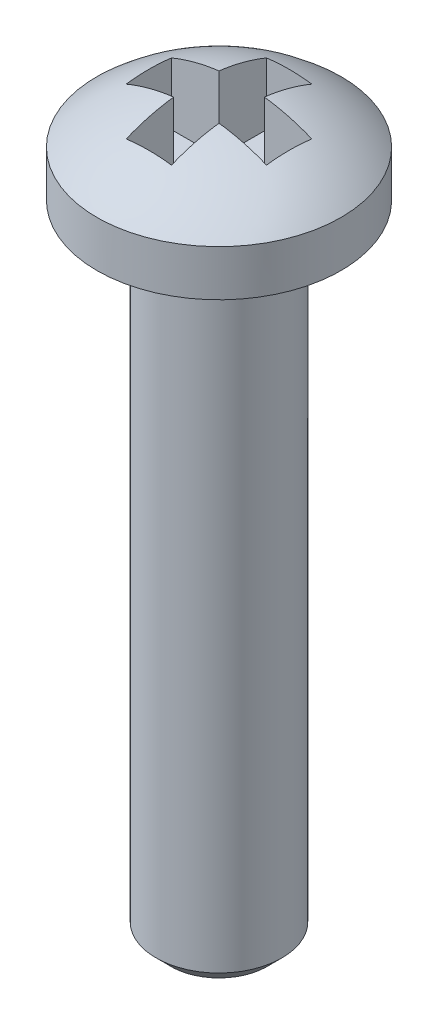
ISO-10303-21;
HEADER;
FILE_DESCRIPTION(('STEP AP214'),'2;1');
FILE_NAME('part.step','',(''),(''),'','','');
FILE_SCHEMA(('AUTOMOTIVE_DESIGN { 1 0 10303 214 1 1 1 1 }'));
ENDSEC;
DATA;
#1=APPLICATION_CONTEXT('core data for automotive mechanical design processes');
#2=APPLICATION_PROTOCOL_DEFINITION('international standard','automotive_design',2000,#1);
#3=PRODUCT_CONTEXT('',#1,'mechanical');
#4=PRODUCT('Part','Part','',(#3));
#5=PRODUCT_RELATED_PRODUCT_CATEGORY('part','',(#4));
#6=PRODUCT_DEFINITION_FORMATION('','',#4);
#7=PRODUCT_DEFINITION_CONTEXT('part definition',#1,'design');
#8=PRODUCT_DEFINITION('design','',#6,#7);
#9=PRODUCT_DEFINITION_SHAPE('','',#8);
#10=(LENGTH_UNIT() NAMED_UNIT(*) SI_UNIT(.MILLI.,.METRE.));
#11=(NAMED_UNIT(*) PLANE_ANGLE_UNIT() SI_UNIT($,.RADIAN.));
#12=(NAMED_UNIT(*) SI_UNIT($,.STERADIAN.) SOLID_ANGLE_UNIT());
#13=UNCERTAINTY_MEASURE_WITH_UNIT(LENGTH_MEASURE(1.E-05),#10,'distance_accuracy_value','');
#14=(GEOMETRIC_REPRESENTATION_CONTEXT(3) GLOBAL_UNCERTAINTY_ASSIGNED_CONTEXT((#13)) GLOBAL_UNIT_ASSIGNED_CONTEXT((#10,
#11,#12)) REPRESENTATION_CONTEXT('',''));
#15=CARTESIAN_POINT('',(0.,0.,0.));
#16=DIRECTION('',(0.,0.,1.));
#17=DIRECTION('',(1.,0.,0.));
#18=AXIS2_PLACEMENT_3D('',#15,#16,#17);
#19=CARTESIAN_POINT('',(0.,0.,0.));
#20=DIRECTION('',(0.,-1.,0.));
#21=DIRECTION('',(0.,0.,-1.));
#22=AXIS2_PLACEMENT_3D('',#19,#20,#21);
#23=PLANE('',#22);
#24=CARTESIAN_POINT('',(0.,0.,0.));
#25=DIRECTION('',(0.,-1.,0.));
#26=DIRECTION('',(0.,0.,-1.));
#27=AXIS2_PLACEMENT_3D('',#24,#25,#26);
#28=CIRCLE('',#27,0.8382);
#29=CARTESIAN_POINT('',(0.,0.,-0.8382));
#30=VERTEX_POINT('',#29);
#31=EDGE_CURVE('E200',#30,#30,#28,.T.);
#32=ORIENTED_EDGE('',*,*,#31,.T.);
#33=EDGE_LOOP('',(#32));
#34=FACE_BOUND('',#33,.T.);
#35=ADVANCED_FACE('F38',(#34),#23,.T.);
#36=CARTESIAN_POINT('',(0.,9.50161587301587,0.));
#37=DIRECTION('',(0.,-1.,0.));
#38=DIRECTION('',(1.,0.,0.));
#39=AXIS2_PLACEMENT_3D('',#36,#37,#38);
#40=SPHERICAL_SURFACE('',#39,3.21108412698413);
#41=CARTESIAN_POINT('',(-1.2192,9.50161587301587,0.));
#42=DIRECTION('',(-1.,0.,0.));
#43=DIRECTION('',(0.,0.,1.));
#44=AXIS2_PLACEMENT_3D('',#41,#42,#43);
#45=CIRCLE('',#44,2.97062495622881);
#46=CARTESIAN_POINT('',(-1.2192,12.4460365190122,-0.3937));
#47=VERTEX_POINT('',#46);
#48=CARTESIAN_POINT('',(-1.2192,12.4460365190122,0.3937));
#49=VERTEX_POINT('',#48);
#50=EDGE_CURVE('E12',#47,#49,#45,.F.);
#51=ORIENTED_EDGE('',*,*,#50,.F.);
#52=CARTESIAN_POINT('',(0.,9.50161587301587,-0.3937));
#53=DIRECTION('',(0.,0.,-1.));
#54=DIRECTION('',(-1.,0.,0.));
#55=AXIS2_PLACEMENT_3D('',#52,#53,#54);
#56=CIRCLE('',#55,3.18685763418597);
#57=CARTESIAN_POINT('',(-0.3937,12.6640614283685,-0.3937));
#58=VERTEX_POINT('',#57);
#59=EDGE_CURVE('E215',#58,#47,#56,.F.);
#60=ORIENTED_EDGE('',*,*,#59,.F.);
#61=CARTESIAN_POINT('',(-0.3937,9.50161587301587,0.));
#62=DIRECTION('',(-1.,0.,0.));
#63=DIRECTION('',(0.,0.,1.));
#64=AXIS2_PLACEMENT_3D('',#61,#62,#63);
#65=CIRCLE('',#64,3.18685763418597);
#66=CARTESIAN_POINT('',(-0.3937,12.4460365190122,-1.2192));
#67=VERTEX_POINT('',#66);
#68=EDGE_CURVE('E217',#67,#58,#65,.F.);
#69=ORIENTED_EDGE('',*,*,#68,.F.);
#70=CARTESIAN_POINT('',(0.,9.50161587301587,-1.2192));
#71=DIRECTION('',(0.,0.,-1.));
#72=DIRECTION('',(-1.,0.,0.));
#73=AXIS2_PLACEMENT_3D('',#70,#71,#72);
#74=CIRCLE('',#73,2.97062495622881);
#75=CARTESIAN_POINT('',(0.3937,12.4460365190122,-1.2192));
#76=VERTEX_POINT('',#75);
#77=EDGE_CURVE('E219',#76,#67,#74,.F.);
#78=ORIENTED_EDGE('',*,*,#77,.F.);
#79=CARTESIAN_POINT('',(0.3937,9.50161587301587,0.));
#80=DIRECTION('',(1.,0.,0.));
#81=DIRECTION('',(0.,0.,-1.));
#82=AXIS2_PLACEMENT_3D('',#79,#80,#81);
#83=CIRCLE('',#82,3.18685763418597);
#84=CARTESIAN_POINT('',(0.3937,12.6640614283685,-0.3937));
#85=VERTEX_POINT('',#84);
#86=EDGE_CURVE('E221',#85,#76,#83,.F.);
#87=ORIENTED_EDGE('',*,*,#86,.F.);
#88=CARTESIAN_POINT('',(0.,9.50161587301587,-0.3937));
#89=DIRECTION('',(0.,0.,-1.));
#90=DIRECTION('',(-1.,0.,0.));
#91=AXIS2_PLACEMENT_3D('',#88,#89,#90);
#92=CIRCLE('',#91,3.18685763418597);
#93=CARTESIAN_POINT('',(1.2192,12.4460365190122,-0.3937));
#94=VERTEX_POINT('',#93);
#95=EDGE_CURVE('E223',#94,#85,#92,.F.);
#96=ORIENTED_EDGE('',*,*,#95,.F.);
#97=CARTESIAN_POINT('',(1.2192,9.50161587301587,0.));
#98=DIRECTION('',(1.,0.,0.));
#99=DIRECTION('',(0.,0.,-1.));
#100=AXIS2_PLACEMENT_3D('',#97,#98,#99);
#101=CIRCLE('',#100,2.97062495622881);
#102=CARTESIAN_POINT('',(1.2192,12.4460365190122,0.3937));
#103=VERTEX_POINT('',#102);
#104=EDGE_CURVE('E225',#103,#94,#101,.F.);
#105=ORIENTED_EDGE('',*,*,#104,.F.);
#106=CARTESIAN_POINT('',(0.,9.50161587301587,0.3937));
#107=DIRECTION('',(0.,0.,1.));
#108=DIRECTION('',(1.,0.,0.));
#109=AXIS2_PLACEMENT_3D('',#106,#107,#108);
#110=CIRCLE('',#109,3.18685763418597);
#111=CARTESIAN_POINT('',(0.3937,12.6640614283685,0.3937));
#112=VERTEX_POINT('',#111);
#113=EDGE_CURVE('E227',#112,#103,#110,.F.);
#114=ORIENTED_EDGE('',*,*,#113,.F.);
#115=CARTESIAN_POINT('',(0.3937,9.50161587301587,0.));
#116=DIRECTION('',(1.,0.,0.));
#117=DIRECTION('',(0.,0.,-1.));
#118=AXIS2_PLACEMENT_3D('',#115,#116,#117);
#119=CIRCLE('',#118,3.18685763418597);
#120=CARTESIAN_POINT('',(0.3937,12.4460365190122,1.2192));
#121=VERTEX_POINT('',#120);
#122=EDGE_CURVE('E229',#121,#112,#119,.F.);
#123=ORIENTED_EDGE('',*,*,#122,.F.);
#124=CARTESIAN_POINT('',(0.,9.50161587301587,1.2192));
#125=DIRECTION('',(0.,0.,1.));
#126=DIRECTION('',(1.,0.,0.));
#127=AXIS2_PLACEMENT_3D('',#124,#125,#126);
#128=CIRCLE('',#127,2.97062495622881);
#129=CARTESIAN_POINT('',(-0.3937,12.4460365190122,1.2192));
#130=VERTEX_POINT('',#129);
#131=EDGE_CURVE('E231',#130,#121,#128,.F.);
#132=ORIENTED_EDGE('',*,*,#131,.F.);
#133=CARTESIAN_POINT('',(-0.3937,9.50161587301587,0.));
#134=DIRECTION('',(-1.,0.,0.));
#135=DIRECTION('',(0.,0.,1.));
#136=AXIS2_PLACEMENT_3D('',#133,#134,#135);
#137=CIRCLE('',#136,3.18685763418597);
#138=CARTESIAN_POINT('',(-0.3937,12.6640614283685,0.3937));
#139=VERTEX_POINT('',#138);
#140=EDGE_CURVE('E233',#139,#130,#137,.F.);
#141=ORIENTED_EDGE('',*,*,#140,.F.);
#142=CARTESIAN_POINT('',(0.,9.50161587301587,0.3937));
#143=DIRECTION('',(0.,0.,1.));
#144=DIRECTION('',(1.,0.,0.));
#145=AXIS2_PLACEMENT_3D('',#142,#143,#144);
#146=CIRCLE('',#145,3.18685763418597);
#147=EDGE_CURVE('E45',#49,#139,#146,.F.);
#148=ORIENTED_EDGE('',*,*,#147,.F.);
#149=EDGE_LOOP('',(#51,#60,#69,#78,#87,#96,#105,#114,#123,#132,#141,#148));
#150=FACE_BOUND('',#149,.T.);
#151=CARTESIAN_POINT('',(0.,11.9126,0.));
#152=DIRECTION('',(0.,-1.,0.));
#153=DIRECTION('',(0.,0.,-1.));
#154=AXIS2_PLACEMENT_3D('',#151,#152,#153);
#155=CIRCLE('',#154,2.1209);
#156=CARTESIAN_POINT('',(0.,11.9126,-2.1209));
#157=VERTEX_POINT('',#156);
#158=EDGE_CURVE('E212',#157,#157,#155,.T.);
#159=ORIENTED_EDGE('',*,*,#158,.F.);
#160=EDGE_LOOP('',(#159));
#161=FACE_BOUND('',#160,.T.);
#162=ADVANCED_FACE('F240',(#150,#161),#40,.T.);
#163=CARTESIAN_POINT('',(0.,0.,0.));
#164=DIRECTION('',(0.,-1.,0.));
#165=DIRECTION('',(0.,0.,-1.));
#166=AXIS2_PLACEMENT_3D('',#163,#164,#165);
#167=CYLINDRICAL_SURFACE('',#166,2.1209);
#168=ORIENTED_EDGE('',*,*,#158,.T.);
#169=EDGE_LOOP('',(#168));
#170=FACE_BOUND('',#169,.T.);
#171=CARTESIAN_POINT('',(0.,11.1125,0.));
#172=DIRECTION('',(0.,-1.,0.));
#173=DIRECTION('',(0.,0.,-1.));
#174=AXIS2_PLACEMENT_3D('',#171,#172,#173);
#175=CIRCLE('',#174,2.1209);
#176=CARTESIAN_POINT('',(0.,11.1125,-2.1209));
#177=VERTEX_POINT('',#176);
#178=EDGE_CURVE('E209',#177,#177,#175,.T.);
#179=ORIENTED_EDGE('',*,*,#178,.F.);
#180=EDGE_LOOP('',(#179));
#181=FACE_BOUND('',#180,.T.);
#182=ADVANCED_FACE('F285',(#170,#181),#167,.T.);
#183=CARTESIAN_POINT('',(1.0922,11.1125,0.));
#184=DIRECTION('',(0.,-1.,0.));
#185=DIRECTION('',(0.,0.,-1.));
#186=AXIS2_PLACEMENT_3D('',#183,#184,#185);
#187=PLANE('',#186);
#188=ORIENTED_EDGE('',*,*,#178,.T.);
#189=EDGE_LOOP('',(#188));
#190=FACE_BOUND('',#189,.T.);
#191=CARTESIAN_POINT('',(0.,11.1125,0.));
#192=DIRECTION('',(0.,-1.,0.));
#193=DIRECTION('',(0.,0.,-1.));
#194=AXIS2_PLACEMENT_3D('',#191,#192,#193);
#195=CIRCLE('',#194,1.0922);
#196=CARTESIAN_POINT('',(0.,11.1125,-1.0922));
#197=VERTEX_POINT('',#196);
#198=EDGE_CURVE('E206',#197,#197,#195,.T.);
#199=ORIENTED_EDGE('',*,*,#198,.F.);
#200=EDGE_LOOP('',(#199));
#201=FACE_BOUND('',#200,.T.);
#202=ADVANCED_FACE('F298',(#190,#201),#187,.T.);
#203=CARTESIAN_POINT('',(0.,0.,0.));
#204=DIRECTION('',(0.,-1.,0.));
#205=DIRECTION('',(0.,0.,-1.));
#206=AXIS2_PLACEMENT_3D('',#203,#204,#205);
#207=CYLINDRICAL_SURFACE('',#206,1.0922);
#208=ORIENTED_EDGE('',*,*,#198,.T.);
#209=EDGE_LOOP('',(#208));
#210=FACE_BOUND('',#209,.T.);
#211=CARTESIAN_POINT('',(0.,0.254,0.));
#212=DIRECTION('',(0.,-1.,0.));
#213=DIRECTION('',(0.,0.,-1.));
#214=AXIS2_PLACEMENT_3D('',#211,#212,#213);
#215=CIRCLE('',#214,1.0922);
#216=CARTESIAN_POINT('',(0.,0.254,-1.0922));
#217=VERTEX_POINT('',#216);
#218=EDGE_CURVE('E203',#217,#217,#215,.T.);
#219=ORIENTED_EDGE('',*,*,#218,.F.);
#220=EDGE_LOOP('',(#219));
#221=FACE_BOUND('',#220,.T.);
#222=ADVANCED_FACE('F290',(#210,#221),#207,.T.);
#223=CARTESIAN_POINT('',(0.,0.,0.));
#224=DIRECTION('',(0.,1.,0.));
#225=DIRECTION('',(0.,0.,1.));
#226=AXIS2_PLACEMENT_3D('',#223,#224,#225);
#227=CONICAL_SURFACE('',#226,0.8382,0.785398163397448);
#228=ORIENTED_EDGE('',*,*,#218,.T.);
#229=EDGE_LOOP('',(#228));
#230=FACE_BOUND('',#229,.T.);
#231=ORIENTED_EDGE('',*,*,#31,.F.);
#232=EDGE_LOOP('',(#231));
#233=FACE_BOUND('',#232,.T.);
#234=ADVANCED_FACE('F288',(#230,#233),#227,.T.);
#235=CARTESIAN_POINT('',(1.0922,11.3665,0.));
#236=DIRECTION('',(0.,-1.,0.));
#237=DIRECTION('',(0.,0.,-1.));
#238=AXIS2_PLACEMENT_3D('',#235,#236,#237);
#239=PLANE('',#238);
#240=DIRECTION('',(-1.,0.,0.));
#241=VECTOR('',#240,1.);
#242=CARTESIAN_POINT('',(-1.2192,11.3665,-0.3937));
#243=LINE('',#242,#241);
#244=CARTESIAN_POINT('',(-0.3937,11.3665,-0.3937));
#245=VERTEX_POINT('',#244);
#246=CARTESIAN_POINT('',(-1.2192,11.3665,-0.3937));
#247=VERTEX_POINT('',#246);
#248=EDGE_CURVE('E142',#245,#247,#243,.T.);
#249=ORIENTED_EDGE('',*,*,#248,.T.);
#250=DIRECTION('',(0.,0.,1.));
#251=VECTOR('',#250,1.);
#252=CARTESIAN_POINT('',(-1.2192,11.3665,0.3937));
#253=LINE('',#252,#251);
#254=CARTESIAN_POINT('',(-1.2192,11.3665,0.3937));
#255=VERTEX_POINT('',#254);
#256=EDGE_CURVE('E137',#247,#255,#253,.T.);
#257=ORIENTED_EDGE('',*,*,#256,.T.);
#258=DIRECTION('',(1.,0.,0.));
#259=VECTOR('',#258,1.);
#260=CARTESIAN_POINT('',(-0.3937,11.3665,0.3937));
#261=LINE('',#260,#259);
#262=CARTESIAN_POINT('',(-0.3937,11.3665,0.3937));
#263=VERTEX_POINT('',#262);
#264=EDGE_CURVE('E126',#255,#263,#261,.T.);
#265=ORIENTED_EDGE('',*,*,#264,.T.);
#266=DIRECTION('',(0.,0.,1.));
#267=VECTOR('',#266,1.);
#268=CARTESIAN_POINT('',(-0.3937,11.3665,1.2192));
#269=LINE('',#268,#267);
#270=CARTESIAN_POINT('',(-0.3937,11.3665,1.2192));
#271=VERTEX_POINT('',#270);
#272=EDGE_CURVE('E179',#263,#271,#269,.T.);
#273=ORIENTED_EDGE('',*,*,#272,.T.);
#274=DIRECTION('',(1.,0.,0.));
#275=VECTOR('',#274,1.);
#276=CARTESIAN_POINT('',(0.3937,11.3665,1.2192));
#277=LINE('',#276,#275);
#278=CARTESIAN_POINT('',(0.3937,11.3665,1.2192));
#279=VERTEX_POINT('',#278);
#280=EDGE_CURVE('E175',#271,#279,#277,.T.);
#281=ORIENTED_EDGE('',*,*,#280,.T.);
#282=DIRECTION('',(0.,0.,-1.));
#283=VECTOR('',#282,1.);
#284=CARTESIAN_POINT('',(0.3937,11.3665,0.3937));
#285=LINE('',#284,#283);
#286=CARTESIAN_POINT('',(0.3937,11.3665,0.3937));
#287=VERTEX_POINT('',#286);
#288=EDGE_CURVE('E171',#279,#287,#285,.T.);
#289=ORIENTED_EDGE('',*,*,#288,.T.);
#290=DIRECTION('',(1.,0.,0.));
#291=VECTOR('',#290,1.);
#292=CARTESIAN_POINT('',(1.2192,11.3665,0.3937));
#293=LINE('',#292,#291);
#294=CARTESIAN_POINT('',(1.2192,11.3665,0.3937));
#295=VERTEX_POINT('',#294);
#296=EDGE_CURVE('E167',#287,#295,#293,.T.);
#297=ORIENTED_EDGE('',*,*,#296,.T.);
#298=DIRECTION('',(0.,0.,-1.));
#299=VECTOR('',#298,1.);
#300=CARTESIAN_POINT('',(1.2192,11.3665,-0.3937));
#301=LINE('',#300,#299);
#302=CARTESIAN_POINT('',(1.2192,11.3665,-0.3937));
#303=VERTEX_POINT('',#302);
#304=EDGE_CURVE('E163',#295,#303,#301,.T.);
#305=ORIENTED_EDGE('',*,*,#304,.T.);
#306=DIRECTION('',(-1.,0.,0.));
#307=VECTOR('',#306,1.);
#308=CARTESIAN_POINT('',(0.3937,11.3665,-0.3937));
#309=LINE('',#308,#307);
#310=CARTESIAN_POINT('',(0.3937,11.3665,-0.3937));
#311=VERTEX_POINT('',#310);
#312=EDGE_CURVE('E159',#303,#311,#309,.T.);
#313=ORIENTED_EDGE('',*,*,#312,.T.);
#314=DIRECTION('',(0.,0.,-1.));
#315=VECTOR('',#314,1.);
#316=CARTESIAN_POINT('',(0.3937,11.3665,-1.2192));
#317=LINE('',#316,#315);
#318=CARTESIAN_POINT('',(0.3937,11.3665,-1.2192));
#319=VERTEX_POINT('',#318);
#320=EDGE_CURVE('E155',#311,#319,#317,.T.);
#321=ORIENTED_EDGE('',*,*,#320,.T.);
#322=DIRECTION('',(-1.,0.,0.));
#323=VECTOR('',#322,1.);
#324=CARTESIAN_POINT('',(-0.3937,11.3665,-1.2192));
#325=LINE('',#324,#323);
#326=CARTESIAN_POINT('',(-0.3937,11.3665,-1.2192));
#327=VERTEX_POINT('',#326);
#328=EDGE_CURVE('E151',#319,#327,#325,.T.);
#329=ORIENTED_EDGE('',*,*,#328,.T.);
#330=DIRECTION('',(0.,0.,1.));
#331=VECTOR('',#330,1.);
#332=CARTESIAN_POINT('',(-0.3937,11.3665,-0.3937));
#333=LINE('',#332,#331);
#334=EDGE_CURVE('E148',#327,#245,#333,.T.);
#335=ORIENTED_EDGE('',*,*,#334,.T.);
#336=EDGE_LOOP('',(#249,#257,#265,#273,#281,#289,#297,#305,#313,#321,#329,#335));
#337=FACE_BOUND('',#336,.T.);
#338=ADVANCED_FACE('F140',(#337),#239,.F.);
#339=CARTESIAN_POINT('',(-1.2192,7.66408164950944,0.3937));
#340=DIRECTION('',(-1.,0.,0.));
#341=DIRECTION('',(0.,0.,1.));
#342=AXIS2_PLACEMENT_3D('',#339,#340,#341);
#343=PLANE('',#342);
#344=ORIENTED_EDGE('',*,*,#50,.T.);
#345=DIRECTION('',(0.,1.,0.));
#346=VECTOR('',#345,1.);
#347=CARTESIAN_POINT('',(-1.2192,7.66408164950944,0.3937));
#348=LINE('',#347,#346);
#349=EDGE_CURVE('E128',#255,#49,#348,.T.);
#350=ORIENTED_EDGE('',*,*,#349,.F.);
#351=ORIENTED_EDGE('',*,*,#256,.F.);
#352=DIRECTION('',(0.,1.,0.));
#353=VECTOR('',#352,1.);
#354=CARTESIAN_POINT('',(-1.2192,7.66408164950944,-0.3937));
#355=LINE('',#354,#353);
#356=EDGE_CURVE('E147',#247,#47,#355,.T.);
#357=ORIENTED_EDGE('',*,*,#356,.T.);
#358=EDGE_LOOP('',(#344,#350,#351,#357));
#359=FACE_BOUND('',#358,.T.);
#360=ADVANCED_FACE('F136',(#359),#343,.F.);
#361=CARTESIAN_POINT('',(-0.3937,7.66408164950944,0.3937));
#362=DIRECTION('',(0.,0.,1.));
#363=DIRECTION('',(1.,0.,0.));
#364=AXIS2_PLACEMENT_3D('',#361,#362,#363);
#365=PLANE('',#364);
#366=ORIENTED_EDGE('',*,*,#147,.T.);
#367=DIRECTION('',(0.,1.,0.));
#368=VECTOR('',#367,1.);
#369=CARTESIAN_POINT('',(-0.3937,7.66408164950944,0.3937));
#370=LINE('',#369,#368);
#371=EDGE_CURVE('E131',#263,#139,#370,.T.);
#372=ORIENTED_EDGE('',*,*,#371,.F.);
#373=ORIENTED_EDGE('',*,*,#264,.F.);
#374=ORIENTED_EDGE('',*,*,#349,.T.);
#375=EDGE_LOOP('',(#366,#372,#373,#374));
#376=FACE_BOUND('',#375,.T.);
#377=ADVANCED_FACE('F127',(#376),#365,.F.);
#378=CARTESIAN_POINT('',(-0.3937,7.66408164950944,1.2192));
#379=DIRECTION('',(-1.,0.,0.));
#380=DIRECTION('',(0.,0.,1.));
#381=AXIS2_PLACEMENT_3D('',#378,#379,#380);
#382=PLANE('',#381);
#383=ORIENTED_EDGE('',*,*,#140,.T.);
#384=DIRECTION('',(0.,1.,0.));
#385=VECTOR('',#384,1.);
#386=CARTESIAN_POINT('',(-0.3937,7.66408164950944,1.2192));
#387=LINE('',#386,#385);
#388=EDGE_CURVE('E178',#271,#130,#387,.T.);
#389=ORIENTED_EDGE('',*,*,#388,.F.);
#390=ORIENTED_EDGE('',*,*,#272,.F.);
#391=ORIENTED_EDGE('',*,*,#371,.T.);
#392=EDGE_LOOP('',(#383,#389,#390,#391));
#393=FACE_BOUND('',#392,.T.);
#394=ADVANCED_FACE('F237',(#393),#382,.F.);
#395=CARTESIAN_POINT('',(0.3937,7.66408164950944,1.2192));
#396=DIRECTION('',(0.,0.,1.));
#397=DIRECTION('',(1.,0.,0.));
#398=AXIS2_PLACEMENT_3D('',#395,#396,#397);
#399=PLANE('',#398);
#400=ORIENTED_EDGE('',*,*,#131,.T.);
#401=DIRECTION('',(0.,1.,0.));
#402=VECTOR('',#401,1.);
#403=CARTESIAN_POINT('',(0.3937,7.66408164950944,1.2192));
#404=LINE('',#403,#402);
#405=EDGE_CURVE('E174',#279,#121,#404,.T.);
#406=ORIENTED_EDGE('',*,*,#405,.F.);
#407=ORIENTED_EDGE('',*,*,#280,.F.);
#408=ORIENTED_EDGE('',*,*,#388,.T.);
#409=EDGE_LOOP('',(#400,#406,#407,#408));
#410=FACE_BOUND('',#409,.T.);
#411=ADVANCED_FACE('F246',(#410),#399,.F.);
#412=CARTESIAN_POINT('',(0.3937,7.66408164950944,0.3937));
#413=DIRECTION('',(1.,0.,0.));
#414=DIRECTION('',(0.,0.,-1.));
#415=AXIS2_PLACEMENT_3D('',#412,#413,#414);
#416=PLANE('',#415);
#417=ORIENTED_EDGE('',*,*,#122,.T.);
#418=DIRECTION('',(0.,1.,0.));
#419=VECTOR('',#418,1.);
#420=CARTESIAN_POINT('',(0.3937,7.66408164950944,0.3937));
#421=LINE('',#420,#419);
#422=EDGE_CURVE('E170',#287,#112,#421,.T.);
#423=ORIENTED_EDGE('',*,*,#422,.F.);
#424=ORIENTED_EDGE('',*,*,#288,.F.);
#425=ORIENTED_EDGE('',*,*,#405,.T.);
#426=EDGE_LOOP('',(#417,#423,#424,#425));
#427=FACE_BOUND('',#426,.T.);
#428=ADVANCED_FACE('F248',(#427),#416,.F.);
#429=CARTESIAN_POINT('',(1.2192,7.66408164950944,0.3937));
#430=DIRECTION('',(0.,0.,1.));
#431=DIRECTION('',(1.,0.,0.));
#432=AXIS2_PLACEMENT_3D('',#429,#430,#431);
#433=PLANE('',#432);
#434=ORIENTED_EDGE('',*,*,#113,.T.);
#435=DIRECTION('',(0.,1.,0.));
#436=VECTOR('',#435,1.);
#437=CARTESIAN_POINT('',(1.2192,7.66408164950944,0.3937));
#438=LINE('',#437,#436);
#439=EDGE_CURVE('E166',#295,#103,#438,.T.);
#440=ORIENTED_EDGE('',*,*,#439,.F.);
#441=ORIENTED_EDGE('',*,*,#296,.F.);
#442=ORIENTED_EDGE('',*,*,#422,.T.);
#443=EDGE_LOOP('',(#434,#440,#441,#442));
#444=FACE_BOUND('',#443,.T.);
#445=ADVANCED_FACE('F252',(#444),#433,.F.);
#446=CARTESIAN_POINT('',(1.2192,7.66408164950944,-0.3937));
#447=DIRECTION('',(1.,0.,0.));
#448=DIRECTION('',(0.,0.,-1.));
#449=AXIS2_PLACEMENT_3D('',#446,#447,#448);
#450=PLANE('',#449);
#451=ORIENTED_EDGE('',*,*,#104,.T.);
#452=DIRECTION('',(0.,1.,0.));
#453=VECTOR('',#452,1.);
#454=CARTESIAN_POINT('',(1.2192,7.66408164950944,-0.3937));
#455=LINE('',#454,#453);
#456=EDGE_CURVE('E162',#303,#94,#455,.T.);
#457=ORIENTED_EDGE('',*,*,#456,.F.);
#458=ORIENTED_EDGE('',*,*,#304,.F.);
#459=ORIENTED_EDGE('',*,*,#439,.T.);
#460=EDGE_LOOP('',(#451,#457,#458,#459));
#461=FACE_BOUND('',#460,.T.);
#462=ADVANCED_FACE('F255',(#461),#450,.F.);
#463=CARTESIAN_POINT('',(0.3937,7.66408164950944,-0.3937));
#464=DIRECTION('',(0.,0.,-1.));
#465=DIRECTION('',(-1.,0.,0.));
#466=AXIS2_PLACEMENT_3D('',#463,#464,#465);
#467=PLANE('',#466);
#468=ORIENTED_EDGE('',*,*,#95,.T.);
#469=DIRECTION('',(0.,1.,0.));
#470=VECTOR('',#469,1.);
#471=CARTESIAN_POINT('',(0.3937,7.66408164950944,-0.3937));
#472=LINE('',#471,#470);
#473=EDGE_CURVE('E158',#311,#85,#472,.T.);
#474=ORIENTED_EDGE('',*,*,#473,.F.);
#475=ORIENTED_EDGE('',*,*,#312,.F.);
#476=ORIENTED_EDGE('',*,*,#456,.T.);
#477=EDGE_LOOP('',(#468,#474,#475,#476));
#478=FACE_BOUND('',#477,.T.);
#479=ADVANCED_FACE('F262',(#478),#467,.F.);
#480=CARTESIAN_POINT('',(0.3937,7.66408164950944,-1.2192));
#481=DIRECTION('',(1.,0.,0.));
#482=DIRECTION('',(0.,0.,-1.));
#483=AXIS2_PLACEMENT_3D('',#480,#481,#482);
#484=PLANE('',#483);
#485=ORIENTED_EDGE('',*,*,#86,.T.);
#486=DIRECTION('',(0.,1.,0.));
#487=VECTOR('',#486,1.);
#488=CARTESIAN_POINT('',(0.3937,7.66408164950944,-1.2192));
#489=LINE('',#488,#487);
#490=EDGE_CURVE('E154',#319,#76,#489,.T.);
#491=ORIENTED_EDGE('',*,*,#490,.F.);
#492=ORIENTED_EDGE('',*,*,#320,.F.);
#493=ORIENTED_EDGE('',*,*,#473,.T.);
#494=EDGE_LOOP('',(#485,#491,#492,#493));
#495=FACE_BOUND('',#494,.T.);
#496=ADVANCED_FACE('F264',(#495),#484,.F.);
#497=CARTESIAN_POINT('',(-0.3937,7.66408164950944,-1.2192));
#498=DIRECTION('',(0.,0.,-1.));
#499=DIRECTION('',(-1.,0.,0.));
#500=AXIS2_PLACEMENT_3D('',#497,#498,#499);
#501=PLANE('',#500);
#502=ORIENTED_EDGE('',*,*,#77,.T.);
#503=DIRECTION('',(0.,1.,0.));
#504=VECTOR('',#503,1.);
#505=CARTESIAN_POINT('',(-0.3937,7.66408164950944,-1.2192));
#506=LINE('',#505,#504);
#507=EDGE_CURVE('E150',#327,#67,#506,.T.);
#508=ORIENTED_EDGE('',*,*,#507,.F.);
#509=ORIENTED_EDGE('',*,*,#328,.F.);
#510=ORIENTED_EDGE('',*,*,#490,.T.);
#511=EDGE_LOOP('',(#502,#508,#509,#510));
#512=FACE_BOUND('',#511,.T.);
#513=ADVANCED_FACE('F268',(#512),#501,.F.);
#514=CARTESIAN_POINT('',(-0.3937,7.66408164950944,-0.3937));
#515=DIRECTION('',(-1.,0.,0.));
#516=DIRECTION('',(0.,0.,1.));
#517=AXIS2_PLACEMENT_3D('',#514,#515,#516);
#518=PLANE('',#517);
#519=ORIENTED_EDGE('',*,*,#68,.T.);
#520=DIRECTION('',(0.,1.,0.));
#521=VECTOR('',#520,1.);
#522=CARTESIAN_POINT('',(-0.3937,7.66408164950944,-0.3937));
#523=LINE('',#522,#521);
#524=EDGE_CURVE('E52',#245,#58,#523,.T.);
#525=ORIENTED_EDGE('',*,*,#524,.F.);
#526=ORIENTED_EDGE('',*,*,#334,.F.);
#527=ORIENTED_EDGE('',*,*,#507,.T.);
#528=EDGE_LOOP('',(#519,#525,#526,#527));
#529=FACE_BOUND('',#528,.T.);
#530=ADVANCED_FACE('F271',(#529),#518,.F.);
#531=CARTESIAN_POINT('',(-1.2192,7.66408164950944,-0.3937));
#532=DIRECTION('',(0.,0.,-1.));
#533=DIRECTION('',(-1.,0.,0.));
#534=AXIS2_PLACEMENT_3D('',#531,#532,#533);
#535=PLANE('',#534);
#536=ORIENTED_EDGE('',*,*,#59,.T.);
#537=ORIENTED_EDGE('',*,*,#356,.F.);
#538=ORIENTED_EDGE('',*,*,#248,.F.);
#539=ORIENTED_EDGE('',*,*,#524,.T.);
#540=EDGE_LOOP('',(#536,#537,#538,#539));
#541=FACE_BOUND('',#540,.T.);
#542=ADVANCED_FACE('F273',(#541),#535,.F.);
#543=CLOSED_SHELL('',(#35,#162,#182,#202,#222,#234,#338,#360,#377,#394,#411,#428,#445,#462,#479,
#496,#513,#530,#542));
#544=MANIFOLD_SOLID_BREP('B2',#543);
#545=ADVANCED_BREP_SHAPE_REPRESENTATION('',(#18,#544),#14);
#546=SHAPE_DEFINITION_REPRESENTATION(#9,#545);
ENDSEC;
END-ISO-10303-21;
